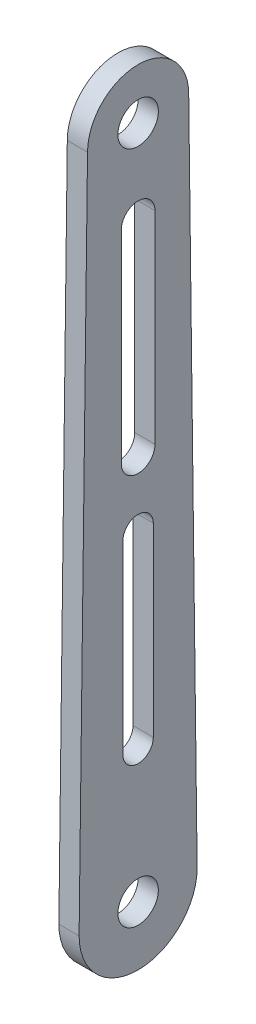
ISO-10303-21;
HEADER;
FILE_DESCRIPTION(('STEP AP214'),'2;1');
FILE_NAME('part.step','',(''),(''),'','','');
FILE_SCHEMA(('AUTOMOTIVE_DESIGN { 1 0 10303 214 1 1 1 1 }'));
ENDSEC;
DATA;
#1=APPLICATION_CONTEXT('core data for automotive mechanical design processes');
#2=APPLICATION_PROTOCOL_DEFINITION('international standard','automotive_design',2000,#1);
#3=PRODUCT_CONTEXT('',#1,'mechanical');
#4=PRODUCT('Part','Part','',(#3));
#5=PRODUCT_RELATED_PRODUCT_CATEGORY('part','',(#4));
#6=PRODUCT_DEFINITION_FORMATION('','',#4);
#7=PRODUCT_DEFINITION_CONTEXT('part definition',#1,'design');
#8=PRODUCT_DEFINITION('design','',#6,#7);
#9=PRODUCT_DEFINITION_SHAPE('','',#8);
#10=(LENGTH_UNIT() NAMED_UNIT(*) SI_UNIT(.MILLI.,.METRE.));
#11=(NAMED_UNIT(*) PLANE_ANGLE_UNIT() SI_UNIT($,.RADIAN.));
#12=(NAMED_UNIT(*) SI_UNIT($,.STERADIAN.) SOLID_ANGLE_UNIT());
#13=UNCERTAINTY_MEASURE_WITH_UNIT(LENGTH_MEASURE(1.E-05),#10,'distance_accuracy_value','');
#14=(GEOMETRIC_REPRESENTATION_CONTEXT(3) GLOBAL_UNCERTAINTY_ASSIGNED_CONTEXT((#13)) GLOBAL_UNIT_ASSIGNED_CONTEXT((#10,
#11,#12)) REPRESENTATION_CONTEXT('',''));
#15=CARTESIAN_POINT('',(0.,0.,0.));
#16=DIRECTION('',(0.,0.,1.));
#17=DIRECTION('',(1.,0.,0.));
#18=AXIS2_PLACEMENT_3D('',#15,#16,#17);
#19=CARTESIAN_POINT('',(6.,0.18747070770192,14.9976566161537));
#20=DIRECTION('',(0.,0.0124990235519259,0.999921884154081));
#21=DIRECTION('',(0.,-0.999921884154082,0.0124990235519259));
#22=AXIS2_PLACEMENT_3D('',#19,#20,#21);
#23=PLANE('',#22);
#24=DIRECTION('',(0.,0.999921884154082,-0.0124990235519259));
#25=VECTOR('',#24,1.);
#26=CARTESIAN_POINT('',(0.,0.18747070770192,14.9976566161537));
#27=LINE('',#26,#25);
#28=CARTESIAN_POINT('',(0.,-200.,17.5));
#29=VERTEX_POINT('',#28);
#30=CARTESIAN_POINT('',(0.,0.,15.));
#31=VERTEX_POINT('',#30);
#32=EDGE_CURVE('E227',#29,#31,#27,.T.);
#33=ORIENTED_EDGE('',*,*,#32,.F.);
#34=DIRECTION('',(-1.,0.,0.));
#35=VECTOR('',#34,1.);
#36=CARTESIAN_POINT('',(6.,-200.,17.5));
#37=LINE('',#36,#35);
#38=CARTESIAN_POINT('',(6.,-200.,17.5));
#39=VERTEX_POINT('',#38);
#40=EDGE_CURVE('E243',#39,#29,#37,.T.);
#41=ORIENTED_EDGE('',*,*,#40,.F.);
#42=DIRECTION('',(0.,0.999921884154082,-0.0124990235519259));
#43=VECTOR('',#42,1.);
#44=CARTESIAN_POINT('',(6.,0.18747070770192,14.9976566161537));
#45=LINE('',#44,#43);
#46=CARTESIAN_POINT('',(6.,0.,15.));
#47=VERTEX_POINT('',#46);
#48=EDGE_CURVE('E203',#39,#47,#45,.T.);
#49=ORIENTED_EDGE('',*,*,#48,.T.);
#50=DIRECTION('',(-1.,0.,0.));
#51=VECTOR('',#50,1.);
#52=CARTESIAN_POINT('',(6.,0.,15.));
#53=LINE('',#52,#51);
#54=EDGE_CURVE('E219',#47,#31,#53,.T.);
#55=ORIENTED_EDGE('',*,*,#54,.T.);
#56=EDGE_LOOP('',(#33,#41,#49,#55));
#57=FACE_BOUND('',#56,.T.);
#58=ADVANCED_FACE('F48',(#57),#23,.T.);
#59=CARTESIAN_POINT('',(6.,-200.,0.));
#60=DIRECTION('',(-1.,0.,0.));
#61=DIRECTION('',(0.,0.,1.));
#62=AXIS2_PLACEMENT_3D('',#59,#60,#61);
#63=CYLINDRICAL_SURFACE('',#62,17.5);
#64=CARTESIAN_POINT('',(0.,-200.,0.));
#65=DIRECTION('',(1.,0.,0.));
#66=DIRECTION('',(0.,0.,-1.));
#67=AXIS2_PLACEMENT_3D('',#64,#65,#66);
#68=CIRCLE('',#67,17.5);
#69=CARTESIAN_POINT('',(0.,-200.,-17.5));
#70=VERTEX_POINT('',#69);
#71=EDGE_CURVE('E230',#29,#70,#68,.T.);
#72=ORIENTED_EDGE('',*,*,#71,.T.);
#73=DIRECTION('',(-1.,0.,0.));
#74=VECTOR('',#73,1.);
#75=CARTESIAN_POINT('',(6.,-200.,-17.5));
#76=LINE('',#75,#74);
#77=CARTESIAN_POINT('',(6.,-200.,-17.5));
#78=VERTEX_POINT('',#77);
#79=EDGE_CURVE('E241',#78,#70,#76,.T.);
#80=ORIENTED_EDGE('',*,*,#79,.F.);
#81=CARTESIAN_POINT('',(6.,-200.,0.));
#82=DIRECTION('',(1.,0.,0.));
#83=DIRECTION('',(0.,0.,-1.));
#84=AXIS2_PLACEMENT_3D('',#81,#82,#83);
#85=CIRCLE('',#84,17.5);
#86=EDGE_CURVE('E207',#39,#78,#85,.T.);
#87=ORIENTED_EDGE('',*,*,#86,.F.);
#88=ORIENTED_EDGE('',*,*,#40,.T.);
#89=EDGE_LOOP('',(#72,#80,#87,#88));
#90=FACE_BOUND('',#89,.T.);
#91=ADVANCED_FACE('F312',(#90),#63,.T.);
#92=CARTESIAN_POINT('',(6.,0.18747070770192,-14.9976566161537));
#93=DIRECTION('',(0.,0.0124990235519259,-0.999921884154081));
#94=DIRECTION('',(0.,0.999921884154082,0.0124990235519259));
#95=AXIS2_PLACEMENT_3D('',#92,#93,#94);
#96=PLANE('',#95);
#97=DIRECTION('',(0.,-0.999921884154082,-0.0124990235519259));
#98=VECTOR('',#97,1.);
#99=CARTESIAN_POINT('',(0.,0.18747070770192,-14.9976566161537));
#100=LINE('',#99,#98);
#101=CARTESIAN_POINT('',(0.,0.,-15.));
#102=VERTEX_POINT('',#101);
#103=EDGE_CURVE('E233',#102,#70,#100,.T.);
#104=ORIENTED_EDGE('',*,*,#103,.F.);
#105=DIRECTION('',(-1.,0.,0.));
#106=VECTOR('',#105,1.);
#107=CARTESIAN_POINT('',(6.,0.,-15.));
#108=LINE('',#107,#106);
#109=CARTESIAN_POINT('',(6.,0.,-15.));
#110=VERTEX_POINT('',#109);
#111=EDGE_CURVE('E239',#110,#102,#108,.T.);
#112=ORIENTED_EDGE('',*,*,#111,.F.);
#113=DIRECTION('',(0.,-0.999921884154082,-0.0124990235519259));
#114=VECTOR('',#113,1.);
#115=CARTESIAN_POINT('',(6.,0.18747070770192,-14.9976566161537));
#116=LINE('',#115,#114);
#117=EDGE_CURVE('E211',#110,#78,#116,.T.);
#118=ORIENTED_EDGE('',*,*,#117,.T.);
#119=ORIENTED_EDGE('',*,*,#79,.T.);
#120=EDGE_LOOP('',(#104,#112,#118,#119));
#121=FACE_BOUND('',#120,.T.);
#122=ADVANCED_FACE('F318',(#121),#96,.T.);
#123=CARTESIAN_POINT('',(6.,0.,0.));
#124=DIRECTION('',(-1.,0.,0.));
#125=DIRECTION('',(0.,0.,1.));
#126=AXIS2_PLACEMENT_3D('',#123,#124,#125);
#127=CYLINDRICAL_SURFACE('',#126,6.);
#128=CARTESIAN_POINT('',(6.,0.,0.));
#129=DIRECTION('',(1.,0.,0.));
#130=DIRECTION('',(0.,0.,-1.));
#131=AXIS2_PLACEMENT_3D('',#128,#129,#130);
#132=CIRCLE('',#131,6.);
#133=CARTESIAN_POINT('',(6.,0.,-6.));
#134=VERTEX_POINT('',#133);
#135=EDGE_CURVE('E193',#134,#134,#132,.T.);
#136=ORIENTED_EDGE('',*,*,#135,.T.);
#137=EDGE_LOOP('',(#136));
#138=FACE_BOUND('',#137,.T.);
#139=CARTESIAN_POINT('',(0.,0.,0.));
#140=DIRECTION('',(1.,0.,0.));
#141=DIRECTION('',(0.,0.,-1.));
#142=AXIS2_PLACEMENT_3D('',#139,#140,#141);
#143=CIRCLE('',#142,6.);
#144=CARTESIAN_POINT('',(0.,0.,-6.));
#145=VERTEX_POINT('',#144);
#146=EDGE_CURVE('E223',#145,#145,#143,.T.);
#147=ORIENTED_EDGE('',*,*,#146,.F.);
#148=EDGE_LOOP('',(#147));
#149=FACE_BOUND('',#148,.T.);
#150=ADVANCED_FACE('F323',(#138,#149),#127,.F.);
#151=CARTESIAN_POINT('',(6.,-200.,0.));
#152=DIRECTION('',(-1.,0.,0.));
#153=DIRECTION('',(0.,0.,1.));
#154=AXIS2_PLACEMENT_3D('',#151,#152,#153);
#155=CYLINDRICAL_SURFACE('',#154,6.);
#156=CARTESIAN_POINT('',(6.,-200.,0.));
#157=DIRECTION('',(1.,0.,0.));
#158=DIRECTION('',(0.,0.,-1.));
#159=AXIS2_PLACEMENT_3D('',#156,#157,#158);
#160=CIRCLE('',#159,6.);
#161=CARTESIAN_POINT('',(6.,-200.,-6.));
#162=VERTEX_POINT('',#161);
#163=EDGE_CURVE('E188',#162,#162,#160,.T.);
#164=ORIENTED_EDGE('',*,*,#163,.T.);
#165=EDGE_LOOP('',(#164));
#166=FACE_BOUND('',#165,.T.);
#167=CARTESIAN_POINT('',(0.,-200.,0.));
#168=DIRECTION('',(1.,0.,0.));
#169=DIRECTION('',(0.,0.,-1.));
#170=AXIS2_PLACEMENT_3D('',#167,#168,#169);
#171=CIRCLE('',#170,6.);
#172=CARTESIAN_POINT('',(0.,-200.,-6.));
#173=VERTEX_POINT('',#172);
#174=EDGE_CURVE('E220',#173,#173,#171,.T.);
#175=ORIENTED_EDGE('',*,*,#174,.F.);
#176=EDGE_LOOP('',(#175));
#177=FACE_BOUND('',#176,.T.);
#178=ADVANCED_FACE('F50',(#166,#177),#155,.F.);
#179=CARTESIAN_POINT('',(6.,0.,0.));
#180=DIRECTION('',(-1.,0.,0.));
#181=DIRECTION('',(0.,0.,1.));
#182=AXIS2_PLACEMENT_3D('',#179,#180,#181);
#183=CYLINDRICAL_SURFACE('',#182,15.);
#184=CARTESIAN_POINT('',(0.,0.,0.));
#185=DIRECTION('',(1.,0.,0.));
#186=DIRECTION('',(0.,0.,-1.));
#187=AXIS2_PLACEMENT_3D('',#184,#185,#186);
#188=CIRCLE('',#187,15.);
#189=EDGE_CURVE('E194',#102,#31,#188,.T.);
#190=ORIENTED_EDGE('',*,*,#189,.T.);
#191=ORIENTED_EDGE('',*,*,#54,.F.);
#192=CARTESIAN_POINT('',(6.,0.,0.));
#193=DIRECTION('',(1.,0.,0.));
#194=DIRECTION('',(0.,0.,-1.));
#195=AXIS2_PLACEMENT_3D('',#192,#193,#194);
#196=CIRCLE('',#195,15.);
#197=EDGE_CURVE('E215',#110,#47,#196,.T.);
#198=ORIENTED_EDGE('',*,*,#197,.F.);
#199=ORIENTED_EDGE('',*,*,#111,.T.);
#200=EDGE_LOOP('',(#190,#191,#198,#199));
#201=FACE_BOUND('',#200,.T.);
#202=ADVANCED_FACE('F330',(#201),#183,.T.);
#203=CARTESIAN_POINT('',(6.,0.,0.));
#204=DIRECTION('',(1.,0.,0.));
#205=DIRECTION('',(0.,0.,-1.));
#206=AXIS2_PLACEMENT_3D('',#203,#204,#205);
#207=PLANE('',#206);
#208=CARTESIAN_POINT('',(6.,-25.,0.));
#209=DIRECTION('',(1.,0.,0.));
#210=DIRECTION('',(0.,0.,-1.));
#211=AXIS2_PLACEMENT_3D('',#208,#209,#210);
#212=CIRCLE('',#211,5.);
#213=CARTESIAN_POINT('',(6.,-25.,-5.));
#214=VERTEX_POINT('',#213);
#215=CARTESIAN_POINT('',(6.,-25.,5.));
#216=VERTEX_POINT('',#215);
#217=EDGE_CURVE('E63',#214,#216,#212,.T.);
#218=ORIENTED_EDGE('',*,*,#217,.F.);
#219=DIRECTION('',(0.,1.,0.));
#220=VECTOR('',#219,1.);
#221=CARTESIAN_POINT('',(6.,-25.,-5.));
#222=LINE('',#221,#220);
#223=CARTESIAN_POINT('',(6.,-85.,-5.));
#224=VERTEX_POINT('',#223);
#225=EDGE_CURVE('E162',#224,#214,#222,.T.);
#226=ORIENTED_EDGE('',*,*,#225,.F.);
#227=CARTESIAN_POINT('',(6.,-85.,0.));
#228=DIRECTION('',(1.,0.,0.));
#229=DIRECTION('',(0.,0.,-1.));
#230=AXIS2_PLACEMENT_3D('',#227,#228,#229);
#231=CIRCLE('',#230,4.99999999999999);
#232=CARTESIAN_POINT('',(6.,-85.,4.99999999999999));
#233=VERTEX_POINT('',#232);
#234=EDGE_CURVE('E144',#233,#224,#231,.T.);
#235=ORIENTED_EDGE('',*,*,#234,.F.);
#236=DIRECTION('',(0.,-1.,0.));
#237=VECTOR('',#236,1.);
#238=CARTESIAN_POINT('',(6.,-25.,5.));
#239=LINE('',#238,#237);
#240=EDGE_CURVE('E154',#216,#233,#239,.T.);
#241=ORIENTED_EDGE('',*,*,#240,.F.);
#242=EDGE_LOOP('',(#218,#226,#235,#241));
#243=FACE_BOUND('',#242,.T.);
#244=CARTESIAN_POINT('',(6.,-105.,0.));
#245=DIRECTION('',(1.,0.,0.));
#246=DIRECTION('',(0.,0.,-1.));
#247=AXIS2_PLACEMENT_3D('',#244,#245,#246);
#248=CIRCLE('',#247,4.5);
#249=CARTESIAN_POINT('',(6.,-105.,-4.50000000000001));
#250=VERTEX_POINT('',#249);
#251=CARTESIAN_POINT('',(6.,-105.,4.49999999999999));
#252=VERTEX_POINT('',#251);
#253=EDGE_CURVE('E71',#250,#252,#248,.T.);
#254=ORIENTED_EDGE('',*,*,#253,.F.);
#255=DIRECTION('',(0.,1.,0.));
#256=VECTOR('',#255,1.);
#257=CARTESIAN_POINT('',(6.,-105.,-4.50000000000001));
#258=LINE('',#257,#256);
#259=CARTESIAN_POINT('',(6.,-160.,-4.5));
#260=VERTEX_POINT('',#259);
#261=EDGE_CURVE('E271',#260,#250,#258,.T.);
#262=ORIENTED_EDGE('',*,*,#261,.F.);
#263=CARTESIAN_POINT('',(6.,-160.,0.));
#264=DIRECTION('',(1.,0.,0.));
#265=DIRECTION('',(0.,0.,-1.));
#266=AXIS2_PLACEMENT_3D('',#263,#264,#265);
#267=CIRCLE('',#266,4.49999999999999);
#268=CARTESIAN_POINT('',(6.,-160.,4.49999999999998));
#269=VERTEX_POINT('',#268);
#270=EDGE_CURVE('E280',#269,#260,#267,.T.);
#271=ORIENTED_EDGE('',*,*,#270,.F.);
#272=DIRECTION('',(0.,-1.,0.));
#273=VECTOR('',#272,1.);
#274=CARTESIAN_POINT('',(6.,-105.,4.49999999999999));
#275=LINE('',#274,#273);
#276=EDGE_CURVE('E185',#252,#269,#275,.T.);
#277=ORIENTED_EDGE('',*,*,#276,.F.);
#278=EDGE_LOOP('',(#254,#262,#271,#277));
#279=FACE_BOUND('',#278,.T.);
#280=ORIENTED_EDGE('',*,*,#163,.F.);
#281=EDGE_LOOP('',(#280));
#282=FACE_BOUND('',#281,.T.);
#283=ORIENTED_EDGE('',*,*,#135,.F.);
#284=EDGE_LOOP('',(#283));
#285=FACE_BOUND('',#284,.T.);
#286=ORIENTED_EDGE('',*,*,#48,.F.);
#287=ORIENTED_EDGE('',*,*,#86,.T.);
#288=ORIENTED_EDGE('',*,*,#117,.F.);
#289=ORIENTED_EDGE('',*,*,#197,.T.);
#290=EDGE_LOOP('',(#286,#287,#288,#289));
#291=FACE_BOUND('',#290,.T.);
#292=ADVANCED_FACE('F159',(#243,#279,#282,#285,#291),#207,.T.);
#293=CARTESIAN_POINT('',(0.,0.,0.));
#294=DIRECTION('',(1.,0.,0.));
#295=DIRECTION('',(0.,0.,-1.));
#296=AXIS2_PLACEMENT_3D('',#293,#294,#295);
#297=PLANE('',#296);
#298=DIRECTION('',(0.,1.,0.));
#299=VECTOR('',#298,1.);
#300=CARTESIAN_POINT('',(0.,0.,-5.));
#301=LINE('',#300,#299);
#302=CARTESIAN_POINT('',(0.,-85.,-5.));
#303=VERTEX_POINT('',#302);
#304=CARTESIAN_POINT('',(0.,-25.,-5.));
#305=VERTEX_POINT('',#304);
#306=EDGE_CURVE('E56',#303,#305,#301,.T.);
#307=ORIENTED_EDGE('',*,*,#306,.T.);
#308=CARTESIAN_POINT('',(0.,-25.,0.));
#309=DIRECTION('',(1.,0.,0.));
#310=DIRECTION('',(0.,0.,-1.));
#311=AXIS2_PLACEMENT_3D('',#308,#309,#310);
#312=CIRCLE('',#311,5.);
#313=CARTESIAN_POINT('',(0.,-25.,5.));
#314=VERTEX_POINT('',#313);
#315=EDGE_CURVE('E12',#305,#314,#312,.T.);
#316=ORIENTED_EDGE('',*,*,#315,.T.);
#317=DIRECTION('',(0.,-1.,0.));
#318=VECTOR('',#317,1.);
#319=CARTESIAN_POINT('',(0.,0.,5.00000000000001));
#320=LINE('',#319,#318);
#321=CARTESIAN_POINT('',(0.,-85.,4.99999999999999));
#322=VERTEX_POINT('',#321);
#323=EDGE_CURVE('E257',#314,#322,#320,.T.);
#324=ORIENTED_EDGE('',*,*,#323,.T.);
#325=CARTESIAN_POINT('',(0.,-85.,0.));
#326=DIRECTION('',(1.,0.,0.));
#327=DIRECTION('',(0.,0.,-1.));
#328=AXIS2_PLACEMENT_3D('',#325,#326,#327);
#329=CIRCLE('',#328,4.99999999999999);
#330=EDGE_CURVE('E147',#322,#303,#329,.T.);
#331=ORIENTED_EDGE('',*,*,#330,.T.);
#332=EDGE_LOOP('',(#307,#316,#324,#331));
#333=FACE_BOUND('',#332,.T.);
#334=DIRECTION('',(0.,1.,0.));
#335=VECTOR('',#334,1.);
#336=CARTESIAN_POINT('',(0.,0.,-4.50000000000002));
#337=LINE('',#336,#335);
#338=CARTESIAN_POINT('',(0.,-160.,-4.5));
#339=VERTEX_POINT('',#338);
#340=CARTESIAN_POINT('',(0.,-105.,-4.50000000000001));
#341=VERTEX_POINT('',#340);
#342=EDGE_CURVE('E251',#339,#341,#337,.T.);
#343=ORIENTED_EDGE('',*,*,#342,.T.);
#344=CARTESIAN_POINT('',(0.,-105.,0.));
#345=DIRECTION('',(1.,0.,0.));
#346=DIRECTION('',(0.,0.,-1.));
#347=AXIS2_PLACEMENT_3D('',#344,#345,#346);
#348=CIRCLE('',#347,4.5);
#349=CARTESIAN_POINT('',(0.,-105.,4.49999999999999));
#350=VERTEX_POINT('',#349);
#351=EDGE_CURVE('E254',#341,#350,#348,.T.);
#352=ORIENTED_EDGE('',*,*,#351,.T.);
#353=DIRECTION('',(0.,-1.,0.));
#354=VECTOR('',#353,1.);
#355=CARTESIAN_POINT('',(0.,0.,4.50000000000003));
#356=LINE('',#355,#354);
#357=CARTESIAN_POINT('',(0.,-160.,4.49999999999997));
#358=VERTEX_POINT('',#357);
#359=EDGE_CURVE('E245',#350,#358,#356,.T.);
#360=ORIENTED_EDGE('',*,*,#359,.T.);
#361=CARTESIAN_POINT('',(0.,-160.,0.));
#362=DIRECTION('',(1.,0.,0.));
#363=DIRECTION('',(0.,0.,-1.));
#364=AXIS2_PLACEMENT_3D('',#361,#362,#363);
#365=CIRCLE('',#364,4.49999999999999);
#366=EDGE_CURVE('E248',#358,#339,#365,.T.);
#367=ORIENTED_EDGE('',*,*,#366,.T.);
#368=EDGE_LOOP('',(#343,#352,#360,#367));
#369=FACE_BOUND('',#368,.T.);
#370=ORIENTED_EDGE('',*,*,#174,.T.);
#371=EDGE_LOOP('',(#370));
#372=FACE_BOUND('',#371,.T.);
#373=ORIENTED_EDGE('',*,*,#146,.T.);
#374=EDGE_LOOP('',(#373));
#375=FACE_BOUND('',#374,.T.);
#376=ORIENTED_EDGE('',*,*,#32,.T.);
#377=ORIENTED_EDGE('',*,*,#189,.F.);
#378=ORIENTED_EDGE('',*,*,#103,.T.);
#379=ORIENTED_EDGE('',*,*,#71,.F.);
#380=EDGE_LOOP('',(#376,#377,#378,#379));
#381=FACE_BOUND('',#380,.T.);
#382=ADVANCED_FACE('F261',(#333,#369,#372,#375,#381),#297,.F.);
#383=CARTESIAN_POINT('',(-4.,-105.,0.));
#384=DIRECTION('',(1.,0.,0.));
#385=DIRECTION('',(0.,0.,-1.));
#386=AXIS2_PLACEMENT_3D('',#383,#384,#385);
#387=CYLINDRICAL_SURFACE('',#386,4.5);
#388=DIRECTION('',(1.,0.,0.));
#389=VECTOR('',#388,1.);
#390=CARTESIAN_POINT('',(-4.,-105.,-4.50000000000001));
#391=LINE('',#390,#389);
#392=EDGE_CURVE('E276',#341,#250,#391,.T.);
#393=ORIENTED_EDGE('',*,*,#392,.T.);
#394=ORIENTED_EDGE('',*,*,#253,.T.);
#395=DIRECTION('',(1.,0.,0.));
#396=VECTOR('',#395,1.);
#397=CARTESIAN_POINT('',(-4.,-105.,4.49999999999999));
#398=LINE('',#397,#396);
#399=EDGE_CURVE('E269',#350,#252,#398,.T.);
#400=ORIENTED_EDGE('',*,*,#399,.F.);
#401=ORIENTED_EDGE('',*,*,#351,.F.);
#402=EDGE_LOOP('',(#393,#394,#400,#401));
#403=FACE_BOUND('',#402,.T.);
#404=ADVANCED_FACE('F300',(#403),#387,.F.);
#405=CARTESIAN_POINT('',(-4.,-105.,-4.50000000000001));
#406=DIRECTION('',(0.,0.,-1.));
#407=DIRECTION('',(0.,1.,0.));
#408=AXIS2_PLACEMENT_3D('',#405,#406,#407);
#409=PLANE('',#408);
#410=DIRECTION('',(1.,0.,0.));
#411=VECTOR('',#410,1.);
#412=CARTESIAN_POINT('',(-4.,-160.,-4.5));
#413=LINE('',#412,#411);
#414=EDGE_CURVE('E274',#339,#260,#413,.T.);
#415=ORIENTED_EDGE('',*,*,#414,.T.);
#416=ORIENTED_EDGE('',*,*,#261,.T.);
#417=ORIENTED_EDGE('',*,*,#392,.F.);
#418=ORIENTED_EDGE('',*,*,#342,.F.);
#419=EDGE_LOOP('',(#415,#416,#417,#418));
#420=FACE_BOUND('',#419,.T.);
#421=ADVANCED_FACE('F297',(#420),#409,.F.);
#422=CARTESIAN_POINT('',(-4.,-160.,0.));
#423=DIRECTION('',(1.,0.,0.));
#424=DIRECTION('',(0.,0.,-1.));
#425=AXIS2_PLACEMENT_3D('',#422,#423,#424);
#426=CYLINDRICAL_SURFACE('',#425,4.49999999999999);
#427=DIRECTION('',(1.,0.,0.));
#428=VECTOR('',#427,1.);
#429=CARTESIAN_POINT('',(-4.,-160.,4.49999999999998));
#430=LINE('',#429,#428);
#431=EDGE_CURVE('E272',#358,#269,#430,.T.);
#432=ORIENTED_EDGE('',*,*,#431,.T.);
#433=ORIENTED_EDGE('',*,*,#270,.T.);
#434=ORIENTED_EDGE('',*,*,#414,.F.);
#435=ORIENTED_EDGE('',*,*,#366,.F.);
#436=EDGE_LOOP('',(#432,#433,#434,#435));
#437=FACE_BOUND('',#436,.T.);
#438=ADVANCED_FACE('F298',(#437),#426,.F.);
#439=CARTESIAN_POINT('',(-4.,-105.,4.49999999999999));
#440=DIRECTION('',(0.,0.,1.));
#441=DIRECTION('',(0.,-1.,0.));
#442=AXIS2_PLACEMENT_3D('',#439,#440,#441);
#443=PLANE('',#442);
#444=ORIENTED_EDGE('',*,*,#399,.T.);
#445=ORIENTED_EDGE('',*,*,#276,.T.);
#446=ORIENTED_EDGE('',*,*,#431,.F.);
#447=ORIENTED_EDGE('',*,*,#359,.F.);
#448=EDGE_LOOP('',(#444,#445,#446,#447));
#449=FACE_BOUND('',#448,.T.);
#450=ADVANCED_FACE('F292',(#449),#443,.F.);
#451=CARTESIAN_POINT('',(-4.,-25.,0.));
#452=DIRECTION('',(1.,0.,0.));
#453=DIRECTION('',(0.,0.,-1.));
#454=AXIS2_PLACEMENT_3D('',#451,#452,#453);
#455=CYLINDRICAL_SURFACE('',#454,5.);
#456=DIRECTION('',(1.,0.,0.));
#457=VECTOR('',#456,1.);
#458=CARTESIAN_POINT('',(-4.,-25.,-5.));
#459=LINE('',#458,#457);
#460=EDGE_CURVE('E224',#305,#214,#459,.T.);
#461=ORIENTED_EDGE('',*,*,#460,.T.);
#462=ORIENTED_EDGE('',*,*,#217,.T.);
#463=DIRECTION('',(1.,0.,0.));
#464=VECTOR('',#463,1.);
#465=CARTESIAN_POINT('',(-4.,-25.,5.));
#466=LINE('',#465,#464);
#467=EDGE_CURVE('E151',#314,#216,#466,.T.);
#468=ORIENTED_EDGE('',*,*,#467,.F.);
#469=ORIENTED_EDGE('',*,*,#315,.F.);
#470=EDGE_LOOP('',(#461,#462,#468,#469));
#471=FACE_BOUND('',#470,.T.);
#472=ADVANCED_FACE('F359',(#471),#455,.F.);
#473=CARTESIAN_POINT('',(-4.,-25.,-5.));
#474=DIRECTION('',(0.,0.,-1.));
#475=DIRECTION('',(-1.,0.,0.));
#476=AXIS2_PLACEMENT_3D('',#473,#474,#475);
#477=PLANE('',#476);
#478=DIRECTION('',(1.,0.,0.));
#479=VECTOR('',#478,1.);
#480=CARTESIAN_POINT('',(-4.,-85.,-5.));
#481=LINE('',#480,#479);
#482=EDGE_CURVE('E150',#303,#224,#481,.T.);
#483=ORIENTED_EDGE('',*,*,#482,.T.);
#484=ORIENTED_EDGE('',*,*,#225,.T.);
#485=ORIENTED_EDGE('',*,*,#460,.F.);
#486=ORIENTED_EDGE('',*,*,#306,.F.);
#487=EDGE_LOOP('',(#483,#484,#485,#486));
#488=FACE_BOUND('',#487,.T.);
#489=ADVANCED_FACE('F265',(#488),#477,.F.);
#490=CARTESIAN_POINT('',(-4.,-85.,0.));
#491=DIRECTION('',(1.,0.,0.));
#492=DIRECTION('',(0.,0.,-1.));
#493=AXIS2_PLACEMENT_3D('',#490,#491,#492);
#494=CYLINDRICAL_SURFACE('',#493,4.99999999999999);
#495=DIRECTION('',(1.,0.,0.));
#496=VECTOR('',#495,1.);
#497=CARTESIAN_POINT('',(-4.,-85.,4.99999999999999));
#498=LINE('',#497,#496);
#499=EDGE_CURVE('E139',#322,#233,#498,.T.);
#500=ORIENTED_EDGE('',*,*,#499,.T.);
#501=ORIENTED_EDGE('',*,*,#234,.T.);
#502=ORIENTED_EDGE('',*,*,#482,.F.);
#503=ORIENTED_EDGE('',*,*,#330,.F.);
#504=EDGE_LOOP('',(#500,#501,#502,#503));
#505=FACE_BOUND('',#504,.T.);
#506=ADVANCED_FACE('F141',(#505),#494,.F.);
#507=CARTESIAN_POINT('',(-4.,-25.,5.));
#508=DIRECTION('',(0.,0.,1.));
#509=DIRECTION('',(0.,-1.,0.));
#510=AXIS2_PLACEMENT_3D('',#507,#508,#509);
#511=PLANE('',#510);
#512=ORIENTED_EDGE('',*,*,#467,.T.);
#513=ORIENTED_EDGE('',*,*,#240,.T.);
#514=ORIENTED_EDGE('',*,*,#499,.F.);
#515=ORIENTED_EDGE('',*,*,#323,.F.);
#516=EDGE_LOOP('',(#512,#513,#514,#515));
#517=FACE_BOUND('',#516,.T.);
#518=ADVANCED_FACE('F155',(#517),#511,.F.);
#519=CLOSED_SHELL('',(#58,#91,#122,#150,#178,#202,#292,#382,#404,#421,#438,#450,#472,#489,#506,#518));
#520=MANIFOLD_SOLID_BREP('B2',#519);
#521=ADVANCED_BREP_SHAPE_REPRESENTATION('',(#18,#520),#14);
#522=SHAPE_DEFINITION_REPRESENTATION(#9,#521);
ENDSEC;
END-ISO-10303-21;
